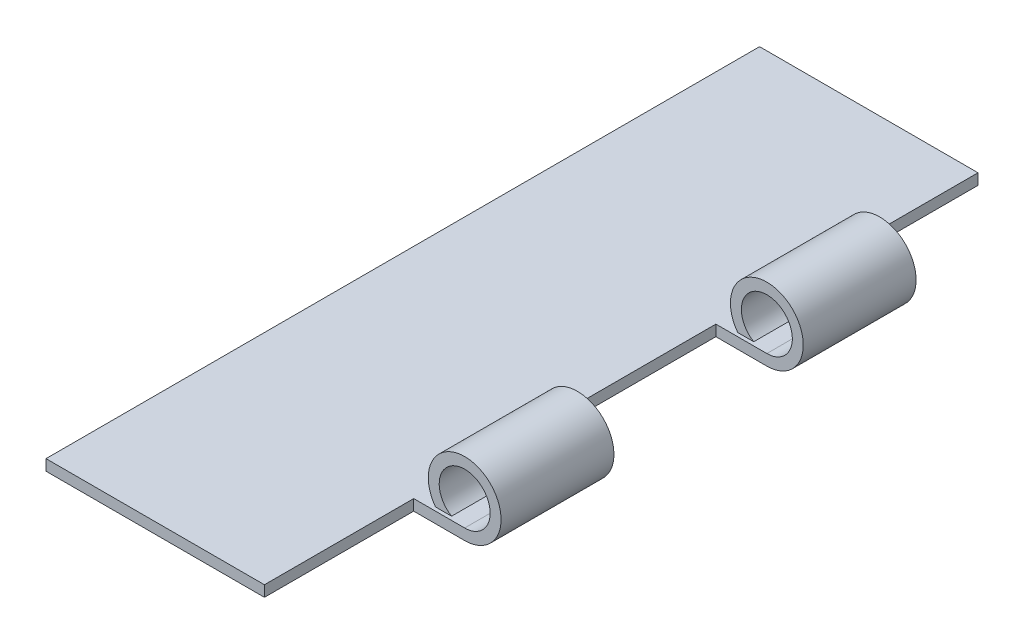
ISO-10303-21;
HEADER;
FILE_DESCRIPTION(('STEP AP214'),'2;1');
FILE_NAME('part.step','',(''),(''),'','','');
FILE_SCHEMA(('AUTOMOTIVE_DESIGN { 1 0 10303 214 1 1 1 1 }'));
ENDSEC;
DATA;
#1=APPLICATION_CONTEXT('core data for automotive mechanical design processes');
#2=APPLICATION_PROTOCOL_DEFINITION('international standard','automotive_design',2000,#1);
#3=PRODUCT_CONTEXT('',#1,'mechanical');
#4=PRODUCT('Part','Part','',(#3));
#5=PRODUCT_RELATED_PRODUCT_CATEGORY('part','',(#4));
#6=PRODUCT_DEFINITION_FORMATION('','',#4);
#7=PRODUCT_DEFINITION_CONTEXT('part definition',#1,'design');
#8=PRODUCT_DEFINITION('design','',#6,#7);
#9=PRODUCT_DEFINITION_SHAPE('','',#8);
#10=(LENGTH_UNIT() NAMED_UNIT(*) SI_UNIT(.MILLI.,.METRE.));
#11=(NAMED_UNIT(*) PLANE_ANGLE_UNIT() SI_UNIT($,.RADIAN.));
#12=(NAMED_UNIT(*) SI_UNIT($,.STERADIAN.) SOLID_ANGLE_UNIT());
#13=UNCERTAINTY_MEASURE_WITH_UNIT(LENGTH_MEASURE(1.E-05),#10,'distance_accuracy_value','');
#14=(GEOMETRIC_REPRESENTATION_CONTEXT(3) GLOBAL_UNCERTAINTY_ASSIGNED_CONTEXT((#13)) GLOBAL_UNIT_ASSIGNED_CONTEXT((#10,
#11,#12)) REPRESENTATION_CONTEXT('',''));
#15=CARTESIAN_POINT('',(0.,0.,0.));
#16=DIRECTION('',(0.,0.,1.));
#17=DIRECTION('',(1.,0.,0.));
#18=AXIS2_PLACEMENT_3D('',#15,#16,#17);
#19=CARTESIAN_POINT('',(37.,5.,98.));
#20=DIRECTION('',(0.,0.,-1.));
#21=DIRECTION('',(-1.,0.,0.));
#22=AXIS2_PLACEMENT_3D('',#19,#20,#21);
#23=CYLINDRICAL_SURFACE('',#22,5.);
#24=CARTESIAN_POINT('',(37.,5.,20.5));
#25=DIRECTION('',(0.,0.,-1.));
#26=DIRECTION('',(-1.,0.,0.));
#27=AXIS2_PLACEMENT_3D('',#24,#25,#26);
#28=CIRCLE('',#27,5.);
#29=CARTESIAN_POINT('',(33.,2.,20.5));
#30=VERTEX_POINT('',#29);
#31=CARTESIAN_POINT('',(37.,0.,20.5));
#32=VERTEX_POINT('',#31);
#33=EDGE_CURVE('E159',#30,#32,#28,.T.);
#34=ORIENTED_EDGE('',*,*,#33,.F.);
#35=DIRECTION('',(0.,0.,-1.));
#36=VECTOR('',#35,1.);
#37=CARTESIAN_POINT('',(33.,2.,98.));
#38=LINE('',#37,#36);
#39=CARTESIAN_POINT('',(33.,2.,36.));
#40=VERTEX_POINT('',#39);
#41=EDGE_CURVE('E242',#40,#30,#38,.T.);
#42=ORIENTED_EDGE('',*,*,#41,.F.);
#43=CARTESIAN_POINT('',(37.,5.,36.));
#44=DIRECTION('',(0.,0.,-1.));
#45=DIRECTION('',(-1.,0.,0.));
#46=AXIS2_PLACEMENT_3D('',#43,#44,#45);
#47=CIRCLE('',#46,5.);
#48=CARTESIAN_POINT('',(37.,0.,36.));
#49=VERTEX_POINT('',#48);
#50=EDGE_CURVE('E178',#40,#49,#47,.T.);
#51=ORIENTED_EDGE('',*,*,#50,.T.);
#52=DIRECTION('',(0.,0.,-1.));
#53=VECTOR('',#52,1.);
#54=CARTESIAN_POINT('',(37.,0.,98.));
#55=LINE('',#54,#53);
#56=EDGE_CURVE('E246',#49,#32,#55,.T.);
#57=ORIENTED_EDGE('',*,*,#56,.T.);
#58=EDGE_LOOP('',(#34,#42,#51,#57));
#59=FACE_BOUND('',#58,.T.);
#60=ADVANCED_FACE('F32',(#59),#23,.T.);
#61=CARTESIAN_POINT('',(33.,2.,98.));
#62=DIRECTION('',(0.,1.,0.));
#63=DIRECTION('',(0.,0.,1.));
#64=AXIS2_PLACEMENT_3D('',#61,#62,#63);
#65=PLANE('',#64);
#66=DIRECTION('',(-1.,0.,0.));
#67=VECTOR('',#66,1.);
#68=CARTESIAN_POINT('',(33.,2.,20.5));
#69=LINE('',#68,#67);
#70=CARTESIAN_POINT('',(35.197224362268,2.,20.5));
#71=VERTEX_POINT('',#70);
#72=EDGE_CURVE('E160',#71,#30,#69,.T.);
#73=ORIENTED_EDGE('',*,*,#72,.F.);
#74=DIRECTION('',(0.,0.,-1.));
#75=VECTOR('',#74,1.);
#76=CARTESIAN_POINT('',(35.197224362268,2.,98.));
#77=LINE('',#76,#75);
#78=CARTESIAN_POINT('',(35.197224362268,2.,36.));
#79=VERTEX_POINT('',#78);
#80=EDGE_CURVE('E238',#79,#71,#77,.T.);
#81=ORIENTED_EDGE('',*,*,#80,.F.);
#82=DIRECTION('',(-1.,0.,0.));
#83=VECTOR('',#82,1.);
#84=CARTESIAN_POINT('',(33.,2.,36.));
#85=LINE('',#84,#83);
#86=EDGE_CURVE('E175',#79,#40,#85,.T.);
#87=ORIENTED_EDGE('',*,*,#86,.T.);
#88=ORIENTED_EDGE('',*,*,#41,.T.);
#89=EDGE_LOOP('',(#73,#81,#87,#88));
#90=FACE_BOUND('',#89,.T.);
#91=ADVANCED_FACE('F274',(#90),#65,.F.);
#92=CARTESIAN_POINT('',(37.,5.,98.));
#93=DIRECTION('',(0.,0.,-1.));
#94=DIRECTION('',(-1.,0.,0.));
#95=AXIS2_PLACEMENT_3D('',#92,#93,#94);
#96=CYLINDRICAL_SURFACE('',#95,3.5);
#97=CARTESIAN_POINT('',(37.,5.,20.5));
#98=DIRECTION('',(0.,0.,-1.));
#99=DIRECTION('',(-1.,0.,0.));
#100=AXIS2_PLACEMENT_3D('',#97,#98,#99);
#101=CIRCLE('',#100,3.5);
#102=CARTESIAN_POINT('',(37.,1.5,20.5));
#103=VERTEX_POINT('',#102);
#104=EDGE_CURVE('E11',#103,#71,#101,.F.);
#105=ORIENTED_EDGE('',*,*,#104,.F.);
#106=DIRECTION('',(0.,0.,-1.));
#107=VECTOR('',#106,1.);
#108=CARTESIAN_POINT('',(37.,1.5,98.));
#109=LINE('',#108,#107);
#110=CARTESIAN_POINT('',(37.,1.5,36.));
#111=VERTEX_POINT('',#110);
#112=EDGE_CURVE('E234',#111,#103,#109,.T.);
#113=ORIENTED_EDGE('',*,*,#112,.F.);
#114=CARTESIAN_POINT('',(37.,5.,36.));
#115=DIRECTION('',(0.,0.,-1.));
#116=DIRECTION('',(-1.,0.,0.));
#117=AXIS2_PLACEMENT_3D('',#114,#115,#116);
#118=CIRCLE('',#117,3.5);
#119=EDGE_CURVE('E40',#111,#79,#118,.F.);
#120=ORIENTED_EDGE('',*,*,#119,.T.);
#121=ORIENTED_EDGE('',*,*,#80,.T.);
#122=EDGE_LOOP('',(#105,#113,#120,#121));
#123=FACE_BOUND('',#122,.T.);
#124=ADVANCED_FACE('F268',(#123),#96,.F.);
#125=CARTESIAN_POINT('',(37.,5.,62.));
#126=DIRECTION('',(0.,0.,-1.));
#127=DIRECTION('',(-1.,0.,0.));
#128=AXIS2_PLACEMENT_3D('',#125,#126,#127);
#129=CIRCLE('',#128,5.);
#130=CARTESIAN_POINT('',(33.,2.,62.));
#131=VERTEX_POINT('',#130);
#132=CARTESIAN_POINT('',(37.,0.,62.));
#133=VERTEX_POINT('',#132);
#134=EDGE_CURVE('E192',#131,#133,#129,.T.);
#135=ORIENTED_EDGE('',*,*,#134,.F.);
#136=CARTESIAN_POINT('',(33.,2.,77.5));
#137=VERTEX_POINT('',#136);
#138=EDGE_CURVE('E243',#137,#131,#38,.T.);
#139=ORIENTED_EDGE('',*,*,#138,.F.);
#140=CARTESIAN_POINT('',(37.,5.,77.5));
#141=DIRECTION('',(0.,0.,-1.));
#142=DIRECTION('',(-1.,0.,0.));
#143=AXIS2_PLACEMENT_3D('',#140,#141,#142);
#144=CIRCLE('',#143,5.);
#145=CARTESIAN_POINT('',(37.,0.,77.5));
#146=VERTEX_POINT('',#145);
#147=EDGE_CURVE('E204',#137,#146,#144,.T.);
#148=ORIENTED_EDGE('',*,*,#147,.T.);
#149=EDGE_CURVE('E247',#146,#133,#55,.T.);
#150=ORIENTED_EDGE('',*,*,#149,.T.);
#151=EDGE_LOOP('',(#135,#139,#148,#150));
#152=FACE_BOUND('',#151,.T.);
#153=ADVANCED_FACE('F302',(#152),#23,.T.);
#154=DIRECTION('',(-1.,0.,0.));
#155=VECTOR('',#154,1.);
#156=CARTESIAN_POINT('',(33.,2.,62.));
#157=LINE('',#156,#155);
#158=CARTESIAN_POINT('',(35.197224362268,2.,62.));
#159=VERTEX_POINT('',#158);
#160=EDGE_CURVE('E190',#159,#131,#157,.T.);
#161=ORIENTED_EDGE('',*,*,#160,.F.);
#162=CARTESIAN_POINT('',(35.197224362268,2.,77.5));
#163=VERTEX_POINT('',#162);
#164=EDGE_CURVE('E239',#163,#159,#77,.T.);
#165=ORIENTED_EDGE('',*,*,#164,.F.);
#166=DIRECTION('',(-1.,0.,0.));
#167=VECTOR('',#166,1.);
#168=CARTESIAN_POINT('',(33.,2.,77.5));
#169=LINE('',#168,#167);
#170=EDGE_CURVE('E201',#163,#137,#169,.T.);
#171=ORIENTED_EDGE('',*,*,#170,.T.);
#172=ORIENTED_EDGE('',*,*,#138,.T.);
#173=EDGE_LOOP('',(#161,#165,#171,#172));
#174=FACE_BOUND('',#173,.T.);
#175=ADVANCED_FACE('F299',(#174),#65,.F.);
#176=CARTESIAN_POINT('',(37.,5.,62.));
#177=DIRECTION('',(0.,0.,-1.));
#178=DIRECTION('',(-1.,0.,0.));
#179=AXIS2_PLACEMENT_3D('',#176,#177,#178);
#180=CIRCLE('',#179,3.5);
#181=CARTESIAN_POINT('',(37.,1.5,62.));
#182=VERTEX_POINT('',#181);
#183=EDGE_CURVE('E261',#182,#159,#180,.F.);
#184=ORIENTED_EDGE('',*,*,#183,.F.);
#185=CARTESIAN_POINT('',(37.,1.5,77.5));
#186=VERTEX_POINT('',#185);
#187=EDGE_CURVE('E235',#186,#182,#109,.T.);
#188=ORIENTED_EDGE('',*,*,#187,.F.);
#189=CARTESIAN_POINT('',(37.,5.,77.5));
#190=DIRECTION('',(0.,0.,-1.));
#191=DIRECTION('',(-1.,0.,0.));
#192=AXIS2_PLACEMENT_3D('',#189,#190,#191);
#193=CIRCLE('',#192,3.5);
#194=EDGE_CURVE('E258',#186,#163,#193,.F.);
#195=ORIENTED_EDGE('',*,*,#194,.T.);
#196=ORIENTED_EDGE('',*,*,#164,.T.);
#197=EDGE_LOOP('',(#184,#188,#195,#196));
#198=FACE_BOUND('',#197,.T.);
#199=ADVANCED_FACE('F294',(#198),#96,.F.);
#200=CARTESIAN_POINT('',(32.,0.,98.));
#201=DIRECTION('',(0.,1.,0.));
#202=DIRECTION('',(0.,0.,1.));
#203=AXIS2_PLACEMENT_3D('',#200,#201,#202);
#204=PLANE('',#203);
#205=DIRECTION('',(0.,0.,1.));
#206=VECTOR('',#205,1.);
#207=CARTESIAN_POINT('',(30.,0.,0.));
#208=LINE('',#207,#206);
#209=CARTESIAN_POINT('',(30.,0.,0.));
#210=VERTEX_POINT('',#209);
#211=CARTESIAN_POINT('',(30.,0.,20.5));
#212=VERTEX_POINT('',#211);
#213=EDGE_CURVE('E55',#210,#212,#208,.T.);
#214=ORIENTED_EDGE('',*,*,#213,.T.);
#215=DIRECTION('',(-1.,0.,0.));
#216=VECTOR('',#215,1.);
#217=CARTESIAN_POINT('',(30.,0.,20.5));
#218=LINE('',#217,#216);
#219=EDGE_CURVE('E147',#32,#212,#218,.T.);
#220=ORIENTED_EDGE('',*,*,#219,.F.);
#221=ORIENTED_EDGE('',*,*,#56,.F.);
#222=DIRECTION('',(1.,0.,0.));
#223=VECTOR('',#222,1.);
#224=CARTESIAN_POINT('',(30.,0.,36.));
#225=LINE('',#224,#223);
#226=CARTESIAN_POINT('',(30.,0.,36.));
#227=VERTEX_POINT('',#226);
#228=EDGE_CURVE('E173',#227,#49,#225,.T.);
#229=ORIENTED_EDGE('',*,*,#228,.F.);
#230=DIRECTION('',(0.,0.,1.));
#231=VECTOR('',#230,1.);
#232=CARTESIAN_POINT('',(30.,0.,0.));
#233=LINE('',#232,#231);
#234=CARTESIAN_POINT('',(30.,0.,62.));
#235=VERTEX_POINT('',#234);
#236=EDGE_CURVE('E215',#227,#235,#233,.T.);
#237=ORIENTED_EDGE('',*,*,#236,.T.);
#238=DIRECTION('',(-1.,0.,0.));
#239=VECTOR('',#238,1.);
#240=CARTESIAN_POINT('',(30.,0.,62.));
#241=LINE('',#240,#239);
#242=EDGE_CURVE('E187',#133,#235,#241,.T.);
#243=ORIENTED_EDGE('',*,*,#242,.F.);
#244=ORIENTED_EDGE('',*,*,#149,.F.);
#245=DIRECTION('',(1.,0.,0.));
#246=VECTOR('',#245,1.);
#247=CARTESIAN_POINT('',(30.,0.,77.5));
#248=LINE('',#247,#246);
#249=CARTESIAN_POINT('',(30.,0.,77.5));
#250=VERTEX_POINT('',#249);
#251=EDGE_CURVE('E199',#250,#146,#248,.T.);
#252=ORIENTED_EDGE('',*,*,#251,.F.);
#253=DIRECTION('',(0.,0.,1.));
#254=VECTOR('',#253,1.);
#255=CARTESIAN_POINT('',(30.,0.,0.));
#256=LINE('',#255,#254);
#257=CARTESIAN_POINT('',(30.,0.,98.));
#258=VERTEX_POINT('',#257);
#259=EDGE_CURVE('E210',#250,#258,#256,.T.);
#260=ORIENTED_EDGE('',*,*,#259,.T.);
#261=DIRECTION('',(1.,0.,0.));
#262=VECTOR('',#261,1.);
#263=CARTESIAN_POINT('',(0.,0.,98.));
#264=LINE('',#263,#262);
#265=CARTESIAN_POINT('',(0.,0.,98.));
#266=VERTEX_POINT('',#265);
#267=EDGE_CURVE('E221',#266,#258,#264,.T.);
#268=ORIENTED_EDGE('',*,*,#267,.F.);
#269=DIRECTION('',(0.,0.,-1.));
#270=VECTOR('',#269,1.);
#271=CARTESIAN_POINT('',(0.,0.,98.));
#272=LINE('',#271,#270);
#273=CARTESIAN_POINT('',(0.,0.,0.));
#274=VERTEX_POINT('',#273);
#275=EDGE_CURVE('E250',#266,#274,#272,.T.);
#276=ORIENTED_EDGE('',*,*,#275,.T.);
#277=DIRECTION('',(1.,0.,0.));
#278=VECTOR('',#277,1.);
#279=CARTESIAN_POINT('',(32.,0.,0.));
#280=LINE('',#279,#278);
#281=EDGE_CURVE('E150',#274,#210,#280,.T.);
#282=ORIENTED_EDGE('',*,*,#281,.T.);
#283=EDGE_LOOP('',(#214,#220,#221,#229,#237,#243,#244,#252,#260,#268,#276,#282));
#284=FACE_BOUND('',#283,.T.);
#285=ADVANCED_FACE('F145',(#284),#204,.F.);
#286=CARTESIAN_POINT('',(0.,1.5,98.));
#287=DIRECTION('',(0.,-1.,0.));
#288=DIRECTION('',(0.,0.,-1.));
#289=AXIS2_PLACEMENT_3D('',#286,#287,#288);
#290=PLANE('',#289);
#291=DIRECTION('',(1.,0.,0.));
#292=VECTOR('',#291,1.);
#293=CARTESIAN_POINT('',(0.,1.5,20.5));
#294=LINE('',#293,#292);
#295=CARTESIAN_POINT('',(30.,1.5,20.5));
#296=VERTEX_POINT('',#295);
#297=EDGE_CURVE('E168',#296,#103,#294,.T.);
#298=ORIENTED_EDGE('',*,*,#297,.F.);
#299=DIRECTION('',(0.,0.,1.));
#300=VECTOR('',#299,1.);
#301=CARTESIAN_POINT('',(30.,1.5,98.));
#302=LINE('',#301,#300);
#303=CARTESIAN_POINT('',(30.,1.5,0.));
#304=VERTEX_POINT('',#303);
#305=EDGE_CURVE('E151',#304,#296,#302,.T.);
#306=ORIENTED_EDGE('',*,*,#305,.F.);
#307=DIRECTION('',(-1.,0.,0.));
#308=VECTOR('',#307,1.);
#309=CARTESIAN_POINT('',(0.,1.5,0.));
#310=LINE('',#309,#308);
#311=CARTESIAN_POINT('',(0.,1.5,0.));
#312=VERTEX_POINT('',#311);
#313=EDGE_CURVE('E222',#304,#312,#310,.T.);
#314=ORIENTED_EDGE('',*,*,#313,.T.);
#315=DIRECTION('',(0.,0.,-1.));
#316=VECTOR('',#315,1.);
#317=CARTESIAN_POINT('',(0.,1.5,98.));
#318=LINE('',#317,#316);
#319=CARTESIAN_POINT('',(0.,1.5,98.));
#320=VERTEX_POINT('',#319);
#321=EDGE_CURVE('E227',#320,#312,#318,.T.);
#322=ORIENTED_EDGE('',*,*,#321,.F.);
#323=DIRECTION('',(-1.,0.,0.));
#324=VECTOR('',#323,1.);
#325=CARTESIAN_POINT('',(32.,1.5,98.));
#326=LINE('',#325,#324);
#327=CARTESIAN_POINT('',(30.,1.5,98.));
#328=VERTEX_POINT('',#327);
#329=EDGE_CURVE('E225',#328,#320,#326,.T.);
#330=ORIENTED_EDGE('',*,*,#329,.F.);
#331=DIRECTION('',(0.,0.,1.));
#332=VECTOR('',#331,1.);
#333=CARTESIAN_POINT('',(30.,1.5,98.));
#334=LINE('',#333,#332);
#335=CARTESIAN_POINT('',(30.,1.5,77.5));
#336=VERTEX_POINT('',#335);
#337=EDGE_CURVE('E47',#336,#328,#334,.T.);
#338=ORIENTED_EDGE('',*,*,#337,.F.);
#339=DIRECTION('',(1.,0.,0.));
#340=VECTOR('',#339,1.);
#341=CARTESIAN_POINT('',(0.,1.5,77.5));
#342=LINE('',#341,#340);
#343=EDGE_CURVE('E207',#336,#186,#342,.T.);
#344=ORIENTED_EDGE('',*,*,#343,.T.);
#345=ORIENTED_EDGE('',*,*,#187,.T.);
#346=DIRECTION('',(1.,0.,0.));
#347=VECTOR('',#346,1.);
#348=CARTESIAN_POINT('',(0.,1.5,62.));
#349=LINE('',#348,#347);
#350=CARTESIAN_POINT('',(30.,1.5,62.));
#351=VERTEX_POINT('',#350);
#352=EDGE_CURVE('E194',#351,#182,#349,.T.);
#353=ORIENTED_EDGE('',*,*,#352,.F.);
#354=DIRECTION('',(0.,0.,1.));
#355=VECTOR('',#354,1.);
#356=CARTESIAN_POINT('',(30.,1.5,98.));
#357=LINE('',#356,#355);
#358=CARTESIAN_POINT('',(30.,1.5,36.));
#359=VERTEX_POINT('',#358);
#360=EDGE_CURVE('E252',#359,#351,#357,.T.);
#361=ORIENTED_EDGE('',*,*,#360,.F.);
#362=DIRECTION('',(1.,0.,0.));
#363=VECTOR('',#362,1.);
#364=CARTESIAN_POINT('',(0.,1.5,36.));
#365=LINE('',#364,#363);
#366=EDGE_CURVE('E181',#359,#111,#365,.T.);
#367=ORIENTED_EDGE('',*,*,#366,.T.);
#368=ORIENTED_EDGE('',*,*,#112,.T.);
#369=EDGE_LOOP('',(#298,#306,#314,#322,#330,#338,#344,#345,#353,#361,#367,#368));
#370=FACE_BOUND('',#369,.T.);
#371=ADVANCED_FACE('F290',(#370),#290,.F.);
#372=CARTESIAN_POINT('',(37.,5.,98.));
#373=DIRECTION('',(0.,0.,1.));
#374=DIRECTION('',(1.,0.,0.));
#375=AXIS2_PLACEMENT_3D('',#372,#373,#374);
#376=PLANE('',#375);
#377=ORIENTED_EDGE('',*,*,#267,.T.);
#378=DIRECTION('',(0.,1.,0.));
#379=VECTOR('',#378,1.);
#380=CARTESIAN_POINT('',(30.,5.,98.));
#381=LINE('',#380,#379);
#382=EDGE_CURVE('E256',#258,#328,#381,.T.);
#383=ORIENTED_EDGE('',*,*,#382,.T.);
#384=ORIENTED_EDGE('',*,*,#329,.T.);
#385=DIRECTION('',(0.,-1.,0.));
#386=VECTOR('',#385,1.);
#387=CARTESIAN_POINT('',(0.,1.5,98.));
#388=LINE('',#387,#386);
#389=EDGE_CURVE('E218',#320,#266,#388,.T.);
#390=ORIENTED_EDGE('',*,*,#389,.T.);
#391=EDGE_LOOP('',(#377,#383,#384,#390));
#392=FACE_BOUND('',#391,.T.);
#393=ADVANCED_FACE('F310',(#392),#376,.T.);
#394=CARTESIAN_POINT('',(37.,5.,0.));
#395=DIRECTION('',(0.,0.,1.));
#396=DIRECTION('',(1.,0.,0.));
#397=AXIS2_PLACEMENT_3D('',#394,#395,#396);
#398=PLANE('',#397);
#399=DIRECTION('',(0.,1.,0.));
#400=VECTOR('',#399,1.);
#401=CARTESIAN_POINT('',(30.,5.,0.));
#402=LINE('',#401,#400);
#403=EDGE_CURVE('E254',#210,#304,#402,.T.);
#404=ORIENTED_EDGE('',*,*,#403,.F.);
#405=ORIENTED_EDGE('',*,*,#281,.F.);
#406=DIRECTION('',(0.,-1.,0.));
#407=VECTOR('',#406,1.);
#408=CARTESIAN_POINT('',(0.,1.5,0.));
#409=LINE('',#408,#407);
#410=EDGE_CURVE('E217',#312,#274,#409,.T.);
#411=ORIENTED_EDGE('',*,*,#410,.F.);
#412=ORIENTED_EDGE('',*,*,#313,.F.);
#413=EDGE_LOOP('',(#404,#405,#411,#412));
#414=FACE_BOUND('',#413,.T.);
#415=ADVANCED_FACE('F318',(#414),#398,.F.);
#416=CARTESIAN_POINT('',(0.,1.5,98.));
#417=DIRECTION('',(1.,0.,0.));
#418=DIRECTION('',(0.,0.,-1.));
#419=AXIS2_PLACEMENT_3D('',#416,#417,#418);
#420=PLANE('',#419);
#421=ORIENTED_EDGE('',*,*,#410,.T.);
#422=ORIENTED_EDGE('',*,*,#275,.F.);
#423=ORIENTED_EDGE('',*,*,#389,.F.);
#424=ORIENTED_EDGE('',*,*,#321,.T.);
#425=EDGE_LOOP('',(#421,#422,#423,#424));
#426=FACE_BOUND('',#425,.T.);
#427=ADVANCED_FACE('F34',(#426),#420,.F.);
#428=CARTESIAN_POINT('',(30.,10.,0.));
#429=DIRECTION('',(1.,0.,0.));
#430=DIRECTION('',(0.,0.,-1.));
#431=AXIS2_PLACEMENT_3D('',#428,#429,#430);
#432=PLANE('',#431);
#433=ORIENTED_EDGE('',*,*,#360,.T.);
#434=DIRECTION('',(0.,1.,0.));
#435=VECTOR('',#434,1.);
#436=CARTESIAN_POINT('',(30.,0.,62.));
#437=LINE('',#436,#435);
#438=EDGE_CURVE('E184',#235,#351,#437,.T.);
#439=ORIENTED_EDGE('',*,*,#438,.F.);
#440=ORIENTED_EDGE('',*,*,#236,.F.);
#441=DIRECTION('',(0.,-1.,0.));
#442=VECTOR('',#441,1.);
#443=CARTESIAN_POINT('',(30.,0.,36.));
#444=LINE('',#443,#442);
#445=EDGE_CURVE('E170',#359,#227,#444,.T.);
#446=ORIENTED_EDGE('',*,*,#445,.F.);
#447=EDGE_LOOP('',(#433,#439,#440,#446));
#448=FACE_BOUND('',#447,.T.);
#449=ADVANCED_FACE('F283',(#448),#432,.T.);
#450=CARTESIAN_POINT('',(30.,10.,0.));
#451=DIRECTION('',(1.,0.,0.));
#452=DIRECTION('',(0.,0.,-1.));
#453=AXIS2_PLACEMENT_3D('',#450,#451,#452);
#454=PLANE('',#453);
#455=ORIENTED_EDGE('',*,*,#305,.T.);
#456=DIRECTION('',(0.,1.,0.));
#457=VECTOR('',#456,1.);
#458=CARTESIAN_POINT('',(30.,0.,20.5));
#459=LINE('',#458,#457);
#460=EDGE_CURVE('E156',#212,#296,#459,.T.);
#461=ORIENTED_EDGE('',*,*,#460,.F.);
#462=ORIENTED_EDGE('',*,*,#213,.F.);
#463=ORIENTED_EDGE('',*,*,#403,.T.);
#464=EDGE_LOOP('',(#455,#461,#462,#463));
#465=FACE_BOUND('',#464,.T.);
#466=ADVANCED_FACE('F162',(#465),#454,.T.);
#467=CARTESIAN_POINT('',(30.,10.,0.));
#468=DIRECTION('',(1.,0.,0.));
#469=DIRECTION('',(0.,0.,-1.));
#470=AXIS2_PLACEMENT_3D('',#467,#468,#469);
#471=PLANE('',#470);
#472=ORIENTED_EDGE('',*,*,#337,.T.);
#473=ORIENTED_EDGE('',*,*,#382,.F.);
#474=ORIENTED_EDGE('',*,*,#259,.F.);
#475=DIRECTION('',(0.,-1.,0.));
#476=VECTOR('',#475,1.);
#477=CARTESIAN_POINT('',(30.,0.,77.5));
#478=LINE('',#477,#476);
#479=EDGE_CURVE('E196',#336,#250,#478,.T.);
#480=ORIENTED_EDGE('',*,*,#479,.F.);
#481=EDGE_LOOP('',(#472,#473,#474,#480));
#482=FACE_BOUND('',#481,.T.);
#483=ADVANCED_FACE('F307',(#482),#471,.T.);
#484=CARTESIAN_POINT('',(0.,0.,77.5));
#485=DIRECTION('',(0.,0.,-1.));
#486=DIRECTION('',(-1.,0.,0.));
#487=AXIS2_PLACEMENT_3D('',#484,#485,#486);
#488=PLANE('',#487);
#489=ORIENTED_EDGE('',*,*,#479,.T.);
#490=ORIENTED_EDGE('',*,*,#251,.T.);
#491=ORIENTED_EDGE('',*,*,#147,.F.);
#492=ORIENTED_EDGE('',*,*,#170,.F.);
#493=ORIENTED_EDGE('',*,*,#194,.F.);
#494=ORIENTED_EDGE('',*,*,#343,.F.);
#495=EDGE_LOOP('',(#489,#490,#491,#492,#493,#494));
#496=FACE_BOUND('',#495,.T.);
#497=ADVANCED_FACE('F306',(#496),#488,.F.);
#498=CARTESIAN_POINT('',(0.,0.,62.));
#499=DIRECTION('',(0.,0.,-1.));
#500=DIRECTION('',(-1.,0.,0.));
#501=AXIS2_PLACEMENT_3D('',#498,#499,#500);
#502=PLANE('',#501);
#503=ORIENTED_EDGE('',*,*,#352,.T.);
#504=ORIENTED_EDGE('',*,*,#183,.T.);
#505=ORIENTED_EDGE('',*,*,#160,.T.);
#506=ORIENTED_EDGE('',*,*,#134,.T.);
#507=ORIENTED_EDGE('',*,*,#242,.T.);
#508=ORIENTED_EDGE('',*,*,#438,.T.);
#509=EDGE_LOOP('',(#503,#504,#505,#506,#507,#508));
#510=FACE_BOUND('',#509,.T.);
#511=ADVANCED_FACE('F287',(#510),#502,.T.);
#512=CARTESIAN_POINT('',(0.,0.,36.));
#513=DIRECTION('',(0.,0.,-1.));
#514=DIRECTION('',(-1.,0.,0.));
#515=AXIS2_PLACEMENT_3D('',#512,#513,#514);
#516=PLANE('',#515);
#517=ORIENTED_EDGE('',*,*,#445,.T.);
#518=ORIENTED_EDGE('',*,*,#228,.T.);
#519=ORIENTED_EDGE('',*,*,#50,.F.);
#520=ORIENTED_EDGE('',*,*,#86,.F.);
#521=ORIENTED_EDGE('',*,*,#119,.F.);
#522=ORIENTED_EDGE('',*,*,#366,.F.);
#523=EDGE_LOOP('',(#517,#518,#519,#520,#521,#522));
#524=FACE_BOUND('',#523,.T.);
#525=ADVANCED_FACE('F280',(#524),#516,.F.);
#526=CARTESIAN_POINT('',(0.,0.,20.5));
#527=DIRECTION('',(0.,0.,-1.));
#528=DIRECTION('',(-1.,0.,0.));
#529=AXIS2_PLACEMENT_3D('',#526,#527,#528);
#530=PLANE('',#529);
#531=ORIENTED_EDGE('',*,*,#297,.T.);
#532=ORIENTED_EDGE('',*,*,#104,.T.);
#533=ORIENTED_EDGE('',*,*,#72,.T.);
#534=ORIENTED_EDGE('',*,*,#33,.T.);
#535=ORIENTED_EDGE('',*,*,#219,.T.);
#536=ORIENTED_EDGE('',*,*,#460,.T.);
#537=EDGE_LOOP('',(#531,#532,#533,#534,#535,#536));
#538=FACE_BOUND('',#537,.T.);
#539=ADVANCED_FACE('F155',(#538),#530,.T.);
#540=CLOSED_SHELL('',(#60,#91,#124,#153,#175,#199,#285,#371,#393,#415,#427,#449,#466,#483,#497,
#511,#525,#539));
#541=MANIFOLD_SOLID_BREP('B2',#540);
#542=ADVANCED_BREP_SHAPE_REPRESENTATION('',(#18,#541),#14);
#543=SHAPE_DEFINITION_REPRESENTATION(#9,#542);
ENDSEC;
END-ISO-10303-21;
